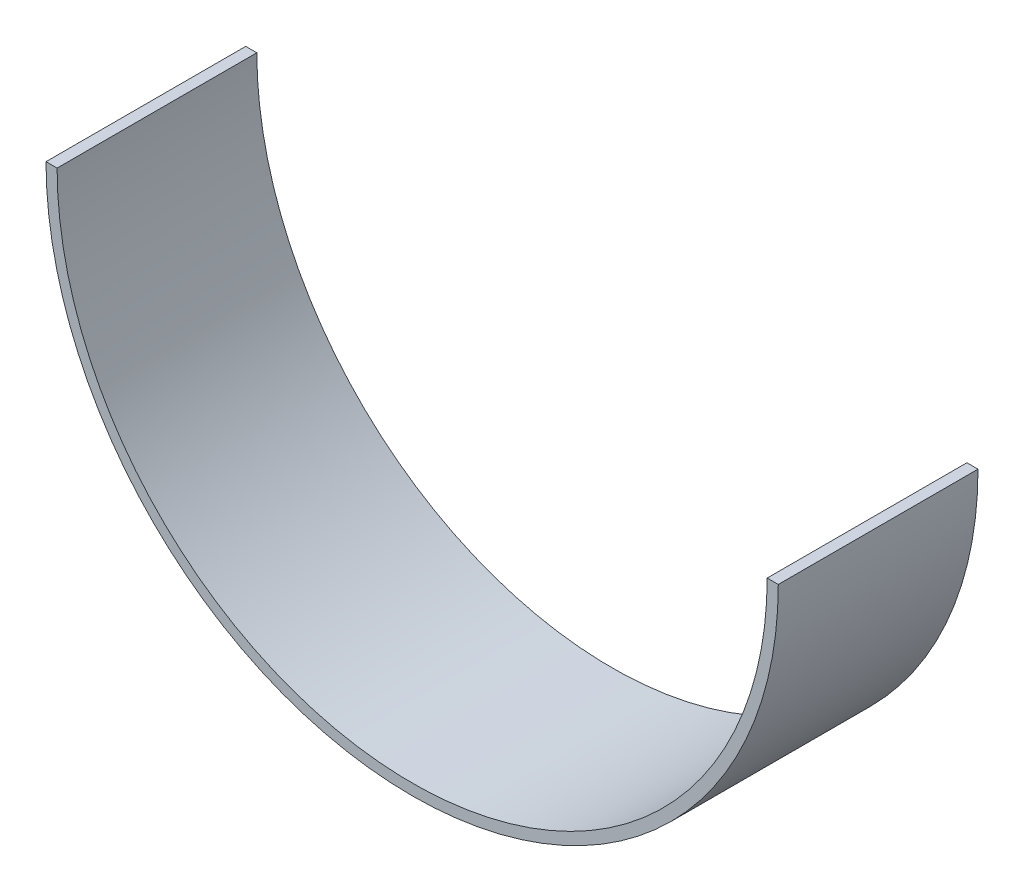
ISO-10303-21;
HEADER;
FILE_DESCRIPTION(('STEP AP214'),'2;1');
FILE_NAME('part.step','',(''),(''),'','','');
FILE_SCHEMA(('AUTOMOTIVE_DESIGN { 1 0 10303 214 1 1 1 1 }'));
ENDSEC;
DATA;
#1=APPLICATION_CONTEXT('core data for automotive mechanical design processes');
#2=APPLICATION_PROTOCOL_DEFINITION('international standard','automotive_design',2000,#1);
#3=PRODUCT_CONTEXT('',#1,'mechanical');
#4=PRODUCT('Part','Part','',(#3));
#5=PRODUCT_RELATED_PRODUCT_CATEGORY('part','',(#4));
#6=PRODUCT_DEFINITION_FORMATION('','',#4);
#7=PRODUCT_DEFINITION_CONTEXT('part definition',#1,'design');
#8=PRODUCT_DEFINITION('design','',#6,#7);
#9=PRODUCT_DEFINITION_SHAPE('','',#8);
#10=(LENGTH_UNIT() NAMED_UNIT(*) SI_UNIT(.MILLI.,.METRE.));
#11=(NAMED_UNIT(*) PLANE_ANGLE_UNIT() SI_UNIT($,.RADIAN.));
#12=(NAMED_UNIT(*) SI_UNIT($,.STERADIAN.) SOLID_ANGLE_UNIT());
#13=UNCERTAINTY_MEASURE_WITH_UNIT(LENGTH_MEASURE(1.E-05),#10,'distance_accuracy_value','');
#14=(GEOMETRIC_REPRESENTATION_CONTEXT(3) GLOBAL_UNCERTAINTY_ASSIGNED_CONTEXT((#13)) GLOBAL_UNIT_ASSIGNED_CONTEXT((#10,
#11,#12)) REPRESENTATION_CONTEXT('',''));
#15=CARTESIAN_POINT('',(0.,0.,0.));
#16=DIRECTION('',(0.,0.,1.));
#17=DIRECTION('',(1.,0.,0.));
#18=AXIS2_PLACEMENT_3D('',#15,#16,#17);
#19=CARTESIAN_POINT('',(0.,0.,9.));
#20=DIRECTION('',(0.,0.,-1.));
#21=DIRECTION('',(-1.,0.,0.));
#22=AXIS2_PLACEMENT_3D('',#19,#20,#21);
#23=CYLINDRICAL_SURFACE('',#22,32.);
#24=CARTESIAN_POINT('',(0.,0.,-9.));
#25=DIRECTION('',(0.,0.,-1.));
#26=DIRECTION('',(1.,0.,0.));
#27=AXIS2_PLACEMENT_3D('',#24,#25,#26);
#28=CIRCLE('',#27,32.);
#29=CARTESIAN_POINT('',(32.,0.,-9.));
#30=VERTEX_POINT('',#29);
#31=CARTESIAN_POINT('',(-32.,0.,-9.));
#32=VERTEX_POINT('',#31);
#33=EDGE_CURVE('E99',#30,#32,#28,.T.);
#34=ORIENTED_EDGE('',*,*,#33,.T.);
#35=DIRECTION('',(0.,0.,-1.));
#36=VECTOR('',#35,1.);
#37=CARTESIAN_POINT('',(-32.,0.,9.));
#38=LINE('',#37,#36);
#39=CARTESIAN_POINT('',(-32.,0.,9.));
#40=VERTEX_POINT('',#39);
#41=EDGE_CURVE('E11',#40,#32,#38,.T.);
#42=ORIENTED_EDGE('',*,*,#41,.F.);
#43=CARTESIAN_POINT('',(0.,0.,9.));
#44=DIRECTION('',(0.,0.,-1.));
#45=DIRECTION('',(1.,0.,0.));
#46=AXIS2_PLACEMENT_3D('',#43,#44,#45);
#47=CIRCLE('',#46,32.);
#48=CARTESIAN_POINT('',(32.,0.,9.));
#49=VERTEX_POINT('',#48);
#50=EDGE_CURVE('E87',#49,#40,#47,.T.);
#51=ORIENTED_EDGE('',*,*,#50,.F.);
#52=DIRECTION('',(0.,0.,-1.));
#53=VECTOR('',#52,1.);
#54=CARTESIAN_POINT('',(32.,0.,9.));
#55=LINE('',#54,#53);
#56=EDGE_CURVE('E95',#49,#30,#55,.T.);
#57=ORIENTED_EDGE('',*,*,#56,.T.);
#58=EDGE_LOOP('',(#34,#42,#51,#57));
#59=FACE_BOUND('',#58,.T.);
#60=ADVANCED_FACE('F36',(#59),#23,.F.);
#61=CARTESIAN_POINT('',(-32.,0.,9.));
#62=DIRECTION('',(0.,-1.,0.));
#63=DIRECTION('',(1.,0.,0.));
#64=AXIS2_PLACEMENT_3D('',#61,#62,#63);
#65=PLANE('',#64);
#66=DIRECTION('',(-1.,0.,0.));
#67=VECTOR('',#66,1.);
#68=CARTESIAN_POINT('',(-32.,0.,-9.));
#69=LINE('',#68,#67);
#70=CARTESIAN_POINT('',(-33.,0.,-9.));
#71=VERTEX_POINT('',#70);
#72=EDGE_CURVE('E91',#32,#71,#69,.T.);
#73=ORIENTED_EDGE('',*,*,#72,.T.);
#74=DIRECTION('',(0.,0.,-1.));
#75=VECTOR('',#74,1.);
#76=CARTESIAN_POINT('',(-33.,0.,9.));
#77=LINE('',#76,#75);
#78=CARTESIAN_POINT('',(-33.,0.,9.));
#79=VERTEX_POINT('',#78);
#80=EDGE_CURVE('E44',#79,#71,#77,.T.);
#81=ORIENTED_EDGE('',*,*,#80,.F.);
#82=DIRECTION('',(-1.,0.,0.));
#83=VECTOR('',#82,1.);
#84=CARTESIAN_POINT('',(-32.,0.,9.));
#85=LINE('',#84,#83);
#86=EDGE_CURVE('E82',#40,#79,#85,.T.);
#87=ORIENTED_EDGE('',*,*,#86,.F.);
#88=ORIENTED_EDGE('',*,*,#41,.T.);
#89=EDGE_LOOP('',(#73,#81,#87,#88));
#90=FACE_BOUND('',#89,.T.);
#91=ADVANCED_FACE('F90',(#90),#65,.F.);
#92=CARTESIAN_POINT('',(0.,0.,9.));
#93=DIRECTION('',(0.,0.,-1.));
#94=DIRECTION('',(-1.,0.,0.));
#95=AXIS2_PLACEMENT_3D('',#92,#93,#94);
#96=CYLINDRICAL_SURFACE('',#95,33.);
#97=CARTESIAN_POINT('',(0.,0.,-9.));
#98=DIRECTION('',(0.,0.,1.));
#99=DIRECTION('',(1.,0.,0.));
#100=AXIS2_PLACEMENT_3D('',#97,#98,#99);
#101=CIRCLE('',#100,33.);
#102=CARTESIAN_POINT('',(33.,0.,-9.));
#103=VERTEX_POINT('',#102);
#104=EDGE_CURVE('E69',#71,#103,#101,.T.);
#105=ORIENTED_EDGE('',*,*,#104,.T.);
#106=DIRECTION('',(0.,0.,-1.));
#107=VECTOR('',#106,1.);
#108=CARTESIAN_POINT('',(33.,0.,9.));
#109=LINE('',#108,#107);
#110=CARTESIAN_POINT('',(33.,0.,9.));
#111=VERTEX_POINT('',#110);
#112=EDGE_CURVE('E92',#111,#103,#109,.T.);
#113=ORIENTED_EDGE('',*,*,#112,.F.);
#114=CARTESIAN_POINT('',(0.,0.,9.));
#115=DIRECTION('',(0.,0.,1.));
#116=DIRECTION('',(1.,0.,0.));
#117=AXIS2_PLACEMENT_3D('',#114,#115,#116);
#118=CIRCLE('',#117,33.);
#119=EDGE_CURVE('E85',#79,#111,#118,.T.);
#120=ORIENTED_EDGE('',*,*,#119,.F.);
#121=ORIENTED_EDGE('',*,*,#80,.T.);
#122=EDGE_LOOP('',(#105,#113,#120,#121));
#123=FACE_BOUND('',#122,.T.);
#124=ADVANCED_FACE('F93',(#123),#96,.T.);
#125=CARTESIAN_POINT('',(33.,0.,9.));
#126=DIRECTION('',(0.,-1.,0.));
#127=DIRECTION('',(1.,0.,0.));
#128=AXIS2_PLACEMENT_3D('',#125,#126,#127);
#129=PLANE('',#128);
#130=DIRECTION('',(-1.,0.,0.));
#131=VECTOR('',#130,1.);
#132=CARTESIAN_POINT('',(33.,0.,-9.));
#133=LINE('',#132,#131);
#134=EDGE_CURVE('E75',#103,#30,#133,.T.);
#135=ORIENTED_EDGE('',*,*,#134,.T.);
#136=ORIENTED_EDGE('',*,*,#56,.F.);
#137=DIRECTION('',(-1.,0.,0.));
#138=VECTOR('',#137,1.);
#139=CARTESIAN_POINT('',(33.,0.,9.));
#140=LINE('',#139,#138);
#141=EDGE_CURVE('E52',#111,#49,#140,.T.);
#142=ORIENTED_EDGE('',*,*,#141,.F.);
#143=ORIENTED_EDGE('',*,*,#112,.T.);
#144=EDGE_LOOP('',(#135,#136,#142,#143));
#145=FACE_BOUND('',#144,.T.);
#146=ADVANCED_FACE('F106',(#145),#129,.F.);
#147=CARTESIAN_POINT('',(0.,0.,9.));
#148=DIRECTION('',(0.,0.,1.));
#149=DIRECTION('',(1.,0.,0.));
#150=AXIS2_PLACEMENT_3D('',#147,#148,#149);
#151=PLANE('',#150);
#152=ORIENTED_EDGE('',*,*,#50,.T.);
#153=ORIENTED_EDGE('',*,*,#86,.T.);
#154=ORIENTED_EDGE('',*,*,#119,.T.);
#155=ORIENTED_EDGE('',*,*,#141,.T.);
#156=EDGE_LOOP('',(#152,#153,#154,#155));
#157=FACE_BOUND('',#156,.T.);
#158=ADVANCED_FACE('F83',(#157),#151,.T.);
#159=CARTESIAN_POINT('',(0.,0.,-9.));
#160=DIRECTION('',(0.,0.,1.));
#161=DIRECTION('',(1.,0.,0.));
#162=AXIS2_PLACEMENT_3D('',#159,#160,#161);
#163=PLANE('',#162);
#164=ORIENTED_EDGE('',*,*,#33,.F.);
#165=ORIENTED_EDGE('',*,*,#134,.F.);
#166=ORIENTED_EDGE('',*,*,#104,.F.);
#167=ORIENTED_EDGE('',*,*,#72,.F.);
#168=EDGE_LOOP('',(#164,#165,#166,#167));
#169=FACE_BOUND('',#168,.T.);
#170=ADVANCED_FACE('F109',(#169),#163,.F.);
#171=CLOSED_SHELL('',(#60,#91,#124,#146,#158,#170));
#172=MANIFOLD_SOLID_BREP('B2',#171);
#173=ADVANCED_BREP_SHAPE_REPRESENTATION('',(#18,#172),#14);
#174=SHAPE_DEFINITION_REPRESENTATION(#9,#173);
ENDSEC;
END-ISO-10303-21;
